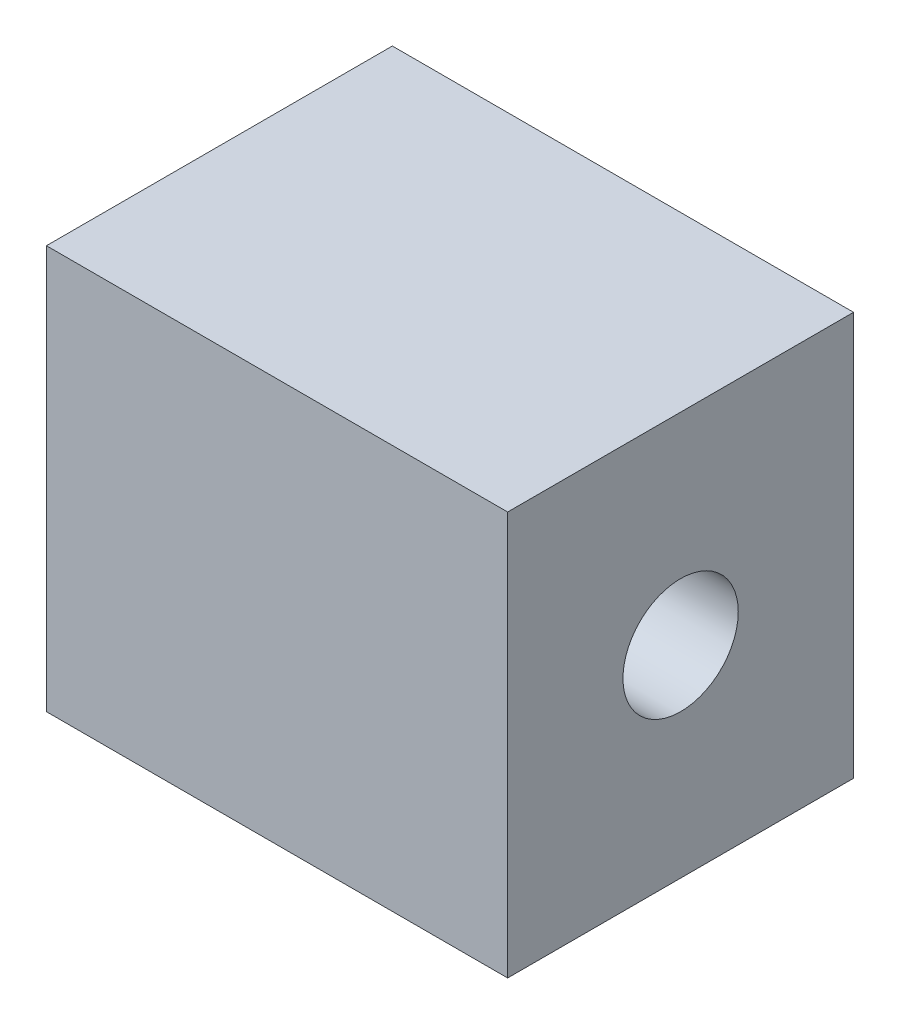
ISO-10303-21;
HEADER;
FILE_DESCRIPTION(('STEP AP214'),'2;1');
FILE_NAME('part.step','',(''),(''),'','','');
FILE_SCHEMA(('AUTOMOTIVE_DESIGN { 1 0 10303 214 1 1 1 1 }'));
ENDSEC;
DATA;
#1=APPLICATION_CONTEXT('core data for automotive mechanical design processes');
#2=APPLICATION_PROTOCOL_DEFINITION('international standard','automotive_design',2000,#1);
#3=PRODUCT_CONTEXT('',#1,'mechanical');
#4=PRODUCT('Part','Part','',(#3));
#5=PRODUCT_RELATED_PRODUCT_CATEGORY('part','',(#4));
#6=PRODUCT_DEFINITION_FORMATION('','',#4);
#7=PRODUCT_DEFINITION_CONTEXT('part definition',#1,'design');
#8=PRODUCT_DEFINITION('design','',#6,#7);
#9=PRODUCT_DEFINITION_SHAPE('','',#8);
#10=(LENGTH_UNIT() NAMED_UNIT(*) SI_UNIT(.MILLI.,.METRE.));
#11=(NAMED_UNIT(*) PLANE_ANGLE_UNIT() SI_UNIT($,.RADIAN.));
#12=(NAMED_UNIT(*) SI_UNIT($,.STERADIAN.) SOLID_ANGLE_UNIT());
#13=UNCERTAINTY_MEASURE_WITH_UNIT(LENGTH_MEASURE(1.E-05),#10,'distance_accuracy_value','');
#14=(GEOMETRIC_REPRESENTATION_CONTEXT(3) GLOBAL_UNCERTAINTY_ASSIGNED_CONTEXT((#13)) GLOBAL_UNIT_ASSIGNED_CONTEXT((#10,
#11,#12)) REPRESENTATION_CONTEXT('',''));
#15=CARTESIAN_POINT('',(0.,0.,0.));
#16=DIRECTION('',(0.,0.,1.));
#17=DIRECTION('',(1.,0.,0.));
#18=AXIS2_PLACEMENT_3D('',#15,#16,#17);
#19=CARTESIAN_POINT('',(20.,17.5,30.));
#20=DIRECTION('',(-1.,0.,0.));
#21=DIRECTION('',(0.,0.,1.));
#22=AXIS2_PLACEMENT_3D('',#19,#20,#21);
#23=PLANE('',#22);
#24=CARTESIAN_POINT('',(20.,0.,15.));
#25=DIRECTION('',(1.,0.,0.));
#26=DIRECTION('',(0.,0.,-1.));
#27=AXIS2_PLACEMENT_3D('',#24,#25,#26);
#28=CIRCLE('',#27,5.);
#29=CARTESIAN_POINT('',(20.,0.,10.));
#30=VERTEX_POINT('',#29);
#31=EDGE_CURVE('E136',#30,#30,#28,.T.);
#32=ORIENTED_EDGE('',*,*,#31,.F.);
#33=EDGE_LOOP('',(#32));
#34=FACE_BOUND('',#33,.T.);
#35=DIRECTION('',(0.,1.,0.));
#36=VECTOR('',#35,1.);
#37=CARTESIAN_POINT('',(20.,17.5,0.));
#38=LINE('',#37,#36);
#39=CARTESIAN_POINT('',(20.,-17.5,0.));
#40=VERTEX_POINT('',#39);
#41=CARTESIAN_POINT('',(20.,17.5,0.));
#42=VERTEX_POINT('',#41);
#43=EDGE_CURVE('E98',#40,#42,#38,.T.);
#44=ORIENTED_EDGE('',*,*,#43,.T.);
#45=DIRECTION('',(0.,0.,-1.));
#46=VECTOR('',#45,1.);
#47=CARTESIAN_POINT('',(20.,17.5,30.));
#48=LINE('',#47,#46);
#49=CARTESIAN_POINT('',(20.,17.5,30.));
#50=VERTEX_POINT('',#49);
#51=EDGE_CURVE('E11',#50,#42,#48,.T.);
#52=ORIENTED_EDGE('',*,*,#51,.F.);
#53=DIRECTION('',(0.,1.,0.));
#54=VECTOR('',#53,1.);
#55=CARTESIAN_POINT('',(20.,17.5,30.));
#56=LINE('',#55,#54);
#57=CARTESIAN_POINT('',(20.,-17.5,30.));
#58=VERTEX_POINT('',#57);
#59=EDGE_CURVE('E86',#58,#50,#56,.T.);
#60=ORIENTED_EDGE('',*,*,#59,.F.);
#61=DIRECTION('',(0.,0.,-1.));
#62=VECTOR('',#61,1.);
#63=CARTESIAN_POINT('',(20.,-17.5,30.));
#64=LINE('',#63,#62);
#65=EDGE_CURVE('E94',#58,#40,#64,.T.);
#66=ORIENTED_EDGE('',*,*,#65,.T.);
#67=EDGE_LOOP('',(#44,#52,#60,#66));
#68=FACE_BOUND('',#67,.T.);
#69=ADVANCED_FACE('F35',(#34,#68),#23,.F.);
#70=CARTESIAN_POINT('',(-20.,17.5,30.));
#71=DIRECTION('',(0.,-1.,0.));
#72=DIRECTION('',(0.,0.,-1.));
#73=AXIS2_PLACEMENT_3D('',#70,#71,#72);
#74=PLANE('',#73);
#75=DIRECTION('',(-1.,0.,0.));
#76=VECTOR('',#75,1.);
#77=CARTESIAN_POINT('',(-20.,17.5,0.));
#78=LINE('',#77,#76);
#79=CARTESIAN_POINT('',(-20.,17.5,0.));
#80=VERTEX_POINT('',#79);
#81=EDGE_CURVE('E90',#42,#80,#78,.T.);
#82=ORIENTED_EDGE('',*,*,#81,.T.);
#83=DIRECTION('',(0.,0.,-1.));
#84=VECTOR('',#83,1.);
#85=CARTESIAN_POINT('',(-20.,17.5,30.));
#86=LINE('',#85,#84);
#87=CARTESIAN_POINT('',(-20.,17.5,30.));
#88=VERTEX_POINT('',#87);
#89=EDGE_CURVE('E43',#88,#80,#86,.T.);
#90=ORIENTED_EDGE('',*,*,#89,.F.);
#91=DIRECTION('',(-1.,0.,0.));
#92=VECTOR('',#91,1.);
#93=CARTESIAN_POINT('',(-20.,17.5,30.));
#94=LINE('',#93,#92);
#95=EDGE_CURVE('E81',#50,#88,#94,.T.);
#96=ORIENTED_EDGE('',*,*,#95,.F.);
#97=ORIENTED_EDGE('',*,*,#51,.T.);
#98=EDGE_LOOP('',(#82,#90,#96,#97));
#99=FACE_BOUND('',#98,.T.);
#100=ADVANCED_FACE('F89',(#99),#74,.F.);
#101=CARTESIAN_POINT('',(-20.,17.5,30.));
#102=DIRECTION('',(1.,0.,0.));
#103=DIRECTION('',(0.,1.,0.));
#104=AXIS2_PLACEMENT_3D('',#101,#102,#103);
#105=PLANE('',#104);
#106=CARTESIAN_POINT('',(-20.,0.,15.));
#107=DIRECTION('',(1.,0.,0.));
#108=DIRECTION('',(0.,0.,-1.));
#109=AXIS2_PLACEMENT_3D('',#106,#107,#108);
#110=CIRCLE('',#109,5.);
#111=CARTESIAN_POINT('',(-20.,0.,10.));
#112=VERTEX_POINT('',#111);
#113=EDGE_CURVE('E122',#112,#112,#110,.T.);
#114=ORIENTED_EDGE('',*,*,#113,.T.);
#115=EDGE_LOOP('',(#114));
#116=FACE_BOUND('',#115,.T.);
#117=DIRECTION('',(0.,-1.,0.));
#118=VECTOR('',#117,1.);
#119=CARTESIAN_POINT('',(-20.,17.5,0.));
#120=LINE('',#119,#118);
#121=CARTESIAN_POINT('',(-20.,-17.5,0.));
#122=VERTEX_POINT('',#121);
#123=EDGE_CURVE('E68',#80,#122,#120,.T.);
#124=ORIENTED_EDGE('',*,*,#123,.T.);
#125=DIRECTION('',(0.,0.,-1.));
#126=VECTOR('',#125,1.);
#127=CARTESIAN_POINT('',(-20.,-17.5,30.));
#128=LINE('',#127,#126);
#129=CARTESIAN_POINT('',(-20.,-17.5,30.));
#130=VERTEX_POINT('',#129);
#131=EDGE_CURVE('E91',#130,#122,#128,.T.);
#132=ORIENTED_EDGE('',*,*,#131,.F.);
#133=DIRECTION('',(0.,-1.,0.));
#134=VECTOR('',#133,1.);
#135=CARTESIAN_POINT('',(-20.,17.5,30.));
#136=LINE('',#135,#134);
#137=EDGE_CURVE('E84',#88,#130,#136,.T.);
#138=ORIENTED_EDGE('',*,*,#137,.F.);
#139=ORIENTED_EDGE('',*,*,#89,.T.);
#140=EDGE_LOOP('',(#124,#132,#138,#139));
#141=FACE_BOUND('',#140,.T.);
#142=ADVANCED_FACE('F92',(#116,#141),#105,.F.);
#143=CARTESIAN_POINT('',(-20.,-17.5,30.));
#144=DIRECTION('',(0.,1.,0.));
#145=DIRECTION('',(0.,0.,1.));
#146=AXIS2_PLACEMENT_3D('',#143,#144,#145);
#147=PLANE('',#146);
#148=DIRECTION('',(1.,0.,0.));
#149=VECTOR('',#148,1.);
#150=CARTESIAN_POINT('',(-20.,-17.5,0.));
#151=LINE('',#150,#149);
#152=EDGE_CURVE('E74',#122,#40,#151,.T.);
#153=ORIENTED_EDGE('',*,*,#152,.T.);
#154=ORIENTED_EDGE('',*,*,#65,.F.);
#155=DIRECTION('',(1.,0.,0.));
#156=VECTOR('',#155,1.);
#157=CARTESIAN_POINT('',(-20.,-17.5,30.));
#158=LINE('',#157,#156);
#159=EDGE_CURVE('E51',#130,#58,#158,.T.);
#160=ORIENTED_EDGE('',*,*,#159,.F.);
#161=ORIENTED_EDGE('',*,*,#131,.T.);
#162=EDGE_LOOP('',(#153,#154,#160,#161));
#163=FACE_BOUND('',#162,.T.);
#164=ADVANCED_FACE('F106',(#163),#147,.F.);
#165=CARTESIAN_POINT('',(0.,0.,30.));
#166=DIRECTION('',(0.,0.,1.));
#167=DIRECTION('',(1.,0.,0.));
#168=AXIS2_PLACEMENT_3D('',#165,#166,#167);
#169=PLANE('',#168);
#170=ORIENTED_EDGE('',*,*,#59,.T.);
#171=ORIENTED_EDGE('',*,*,#95,.T.);
#172=ORIENTED_EDGE('',*,*,#137,.T.);
#173=ORIENTED_EDGE('',*,*,#159,.T.);
#174=EDGE_LOOP('',(#170,#171,#172,#173));
#175=FACE_BOUND('',#174,.T.);
#176=ADVANCED_FACE('F82',(#175),#169,.T.);
#177=CARTESIAN_POINT('',(0.,0.,0.));
#178=DIRECTION('',(0.,0.,1.));
#179=DIRECTION('',(1.,0.,0.));
#180=AXIS2_PLACEMENT_3D('',#177,#178,#179);
#181=PLANE('',#180);
#182=CARTESIAN_POINT('',(-13.9999999999998,-10.5,0.));
#183=DIRECTION('',(0.,0.,1.));
#184=DIRECTION('',(1.,0.,0.));
#185=AXIS2_PLACEMENT_3D('',#182,#183,#184);
#186=CIRCLE('',#185,2.5);
#187=CARTESIAN_POINT('',(-11.4999999999998,-10.5,0.));
#188=VERTEX_POINT('',#187);
#189=EDGE_CURVE('E118',#188,#188,#186,.T.);
#190=ORIENTED_EDGE('',*,*,#189,.T.);
#191=EDGE_LOOP('',(#190));
#192=FACE_BOUND('',#191,.T.);
#193=CARTESIAN_POINT('',(14.0000000000002,-10.5,0.));
#194=DIRECTION('',(0.,0.,1.));
#195=DIRECTION('',(1.,0.,0.));
#196=AXIS2_PLACEMENT_3D('',#193,#194,#195);
#197=CIRCLE('',#196,2.5);
#198=CARTESIAN_POINT('',(16.5000000000002,-10.5,0.));
#199=VERTEX_POINT('',#198);
#200=EDGE_CURVE('E125',#199,#199,#197,.T.);
#201=ORIENTED_EDGE('',*,*,#200,.T.);
#202=EDGE_LOOP('',(#201));
#203=FACE_BOUND('',#202,.T.);
#204=CARTESIAN_POINT('',(14.,10.5,0.));
#205=DIRECTION('',(0.,0.,1.));
#206=DIRECTION('',(1.,0.,0.));
#207=AXIS2_PLACEMENT_3D('',#204,#205,#206);
#208=CIRCLE('',#207,2.5);
#209=CARTESIAN_POINT('',(16.5,10.5,0.));
#210=VERTEX_POINT('',#209);
#211=EDGE_CURVE('E131',#210,#210,#208,.T.);
#212=ORIENTED_EDGE('',*,*,#211,.T.);
#213=EDGE_LOOP('',(#212));
#214=FACE_BOUND('',#213,.T.);
#215=CARTESIAN_POINT('',(-14.,10.5,0.));
#216=DIRECTION('',(0.,0.,1.));
#217=DIRECTION('',(1.,0.,0.));
#218=AXIS2_PLACEMENT_3D('',#215,#216,#217);
#219=CIRCLE('',#218,2.5);
#220=CARTESIAN_POINT('',(-11.5,10.5,0.));
#221=VERTEX_POINT('',#220);
#222=EDGE_CURVE('E112',#221,#221,#219,.T.);
#223=ORIENTED_EDGE('',*,*,#222,.T.);
#224=EDGE_LOOP('',(#223));
#225=FACE_BOUND('',#224,.T.);
#226=ORIENTED_EDGE('',*,*,#43,.F.);
#227=ORIENTED_EDGE('',*,*,#152,.F.);
#228=ORIENTED_EDGE('',*,*,#123,.F.);
#229=ORIENTED_EDGE('',*,*,#81,.F.);
#230=EDGE_LOOP('',(#226,#227,#228,#229));
#231=FACE_BOUND('',#230,.T.);
#232=ADVANCED_FACE('F109',(#192,#203,#214,#225,#231),#181,.F.);
#233=CARTESIAN_POINT('',(-14.,10.5,20.));
#234=DIRECTION('',(0.,0.,-1.));
#235=DIRECTION('',(-1.,0.,0.));
#236=AXIS2_PLACEMENT_3D('',#233,#234,#235);
#237=CYLINDRICAL_SURFACE('',#236,2.5);
#238=CARTESIAN_POINT('',(-14.,10.5,20.));
#239=DIRECTION('',(0.,0.,1.));
#240=DIRECTION('',(1.,0.,0.));
#241=AXIS2_PLACEMENT_3D('',#238,#239,#240);
#242=CIRCLE('',#241,2.5);
#243=CARTESIAN_POINT('',(-11.5,10.5,20.));
#244=VERTEX_POINT('',#243);
#245=EDGE_CURVE('E101',#244,#244,#242,.T.);
#246=ORIENTED_EDGE('',*,*,#245,.T.);
#247=EDGE_LOOP('',(#246));
#248=FACE_BOUND('',#247,.T.);
#249=ORIENTED_EDGE('',*,*,#222,.F.);
#250=EDGE_LOOP('',(#249));
#251=FACE_BOUND('',#250,.T.);
#252=ADVANCED_FACE('F163',(#248,#251),#237,.F.);
#253=CARTESIAN_POINT('',(-14.,10.5,20.));
#254=DIRECTION('',(0.,0.,1.));
#255=DIRECTION('',(1.,0.,0.));
#256=AXIS2_PLACEMENT_3D('',#253,#254,#255);
#257=PLANE('',#256);
#258=ORIENTED_EDGE('',*,*,#245,.F.);
#259=EDGE_LOOP('',(#258));
#260=FACE_BOUND('',#259,.T.);
#261=ADVANCED_FACE('F169',(#260),#257,.F.);
#262=CARTESIAN_POINT('',(14.,10.5,20.));
#263=DIRECTION('',(0.,0.,-1.));
#264=DIRECTION('',(-1.,0.,0.));
#265=AXIS2_PLACEMENT_3D('',#262,#263,#264);
#266=CYLINDRICAL_SURFACE('',#265,2.5);
#267=CARTESIAN_POINT('',(14.,10.5,20.));
#268=DIRECTION('',(0.,0.,1.));
#269=DIRECTION('',(1.,0.,0.));
#270=AXIS2_PLACEMENT_3D('',#267,#268,#269);
#271=CIRCLE('',#270,2.5);
#272=CARTESIAN_POINT('',(16.5,10.5,20.));
#273=VERTEX_POINT('',#272);
#274=EDGE_CURVE('E115',#273,#273,#271,.T.);
#275=ORIENTED_EDGE('',*,*,#274,.T.);
#276=EDGE_LOOP('',(#275));
#277=FACE_BOUND('',#276,.T.);
#278=ORIENTED_EDGE('',*,*,#211,.F.);
#279=EDGE_LOOP('',(#278));
#280=FACE_BOUND('',#279,.T.);
#281=ADVANCED_FACE('F173',(#277,#280),#266,.F.);
#282=CARTESIAN_POINT('',(14.,10.5,20.));
#283=DIRECTION('',(0.,0.,1.));
#284=DIRECTION('',(1.,0.,0.));
#285=AXIS2_PLACEMENT_3D('',#282,#283,#284);
#286=PLANE('',#285);
#287=ORIENTED_EDGE('',*,*,#274,.F.);
#288=EDGE_LOOP('',(#287));
#289=FACE_BOUND('',#288,.T.);
#290=ADVANCED_FACE('F186',(#289),#286,.F.);
#291=CARTESIAN_POINT('',(14.0000000000002,-10.5,20.));
#292=DIRECTION('',(0.,0.,-1.));
#293=DIRECTION('',(-1.,0.,0.));
#294=AXIS2_PLACEMENT_3D('',#291,#292,#293);
#295=CYLINDRICAL_SURFACE('',#294,2.5);
#296=CARTESIAN_POINT('',(14.0000000000002,-10.5,20.));
#297=DIRECTION('',(0.,0.,1.));
#298=DIRECTION('',(1.,0.,0.));
#299=AXIS2_PLACEMENT_3D('',#296,#297,#298);
#300=CIRCLE('',#299,2.5);
#301=CARTESIAN_POINT('',(16.5000000000002,-10.5,20.));
#302=VERTEX_POINT('',#301);
#303=EDGE_CURVE('E128',#302,#302,#300,.T.);
#304=ORIENTED_EDGE('',*,*,#303,.T.);
#305=EDGE_LOOP('',(#304));
#306=FACE_BOUND('',#305,.T.);
#307=ORIENTED_EDGE('',*,*,#200,.F.);
#308=EDGE_LOOP('',(#307));
#309=FACE_BOUND('',#308,.T.);
#310=ADVANCED_FACE('F183',(#306,#309),#295,.F.);
#311=CARTESIAN_POINT('',(14.0000000000002,-10.5,20.));
#312=DIRECTION('',(0.,0.,1.));
#313=DIRECTION('',(1.,0.,0.));
#314=AXIS2_PLACEMENT_3D('',#311,#312,#313);
#315=PLANE('',#314);
#316=ORIENTED_EDGE('',*,*,#303,.F.);
#317=EDGE_LOOP('',(#316));
#318=FACE_BOUND('',#317,.T.);
#319=ADVANCED_FACE('F178',(#318),#315,.F.);
#320=CARTESIAN_POINT('',(-13.9999999999998,-10.5,20.));
#321=DIRECTION('',(0.,0.,-1.));
#322=DIRECTION('',(-1.,0.,0.));
#323=AXIS2_PLACEMENT_3D('',#320,#321,#322);
#324=CYLINDRICAL_SURFACE('',#323,2.5);
#325=CARTESIAN_POINT('',(-13.9999999999998,-10.5,20.));
#326=DIRECTION('',(0.,0.,1.));
#327=DIRECTION('',(1.,0.,0.));
#328=AXIS2_PLACEMENT_3D('',#325,#326,#327);
#329=CIRCLE('',#328,2.5);
#330=CARTESIAN_POINT('',(-11.4999999999998,-10.5,20.));
#331=VERTEX_POINT('',#330);
#332=EDGE_CURVE('E121',#331,#331,#329,.T.);
#333=ORIENTED_EDGE('',*,*,#332,.T.);
#334=EDGE_LOOP('',(#333));
#335=FACE_BOUND('',#334,.T.);
#336=ORIENTED_EDGE('',*,*,#189,.F.);
#337=EDGE_LOOP('',(#336));
#338=FACE_BOUND('',#337,.T.);
#339=ADVANCED_FACE('F175',(#335,#338),#324,.F.);
#340=CARTESIAN_POINT('',(-13.9999999999998,-10.5,20.));
#341=DIRECTION('',(0.,0.,1.));
#342=DIRECTION('',(1.,0.,0.));
#343=AXIS2_PLACEMENT_3D('',#340,#341,#342);
#344=PLANE('',#343);
#345=ORIENTED_EDGE('',*,*,#332,.F.);
#346=EDGE_LOOP('',(#345));
#347=FACE_BOUND('',#346,.T.);
#348=ADVANCED_FACE('F146',(#347),#344,.F.);
#349=CARTESIAN_POINT('',(-20.,0.,15.));
#350=DIRECTION('',(1.,0.,0.));
#351=DIRECTION('',(0.,0.,-1.));
#352=AXIS2_PLACEMENT_3D('',#349,#350,#351);
#353=CYLINDRICAL_SURFACE('',#352,5.);
#354=ORIENTED_EDGE('',*,*,#113,.F.);
#355=EDGE_LOOP('',(#354));
#356=FACE_BOUND('',#355,.T.);
#357=ORIENTED_EDGE('',*,*,#31,.T.);
#358=EDGE_LOOP('',(#357));
#359=FACE_BOUND('',#358,.T.);
#360=ADVANCED_FACE('F143',(#356,#359),#353,.F.);
#361=CLOSED_SHELL('',(#69,#100,#142,#164,#176,#232,#252,#261,#281,#290,#310,#319,#339,#348,#360));
#362=MANIFOLD_SOLID_BREP('B2',#361);
#363=ADVANCED_BREP_SHAPE_REPRESENTATION('',(#18,#362),#14);
#364=SHAPE_DEFINITION_REPRESENTATION(#9,#363);
ENDSEC;
END-ISO-10303-21;
